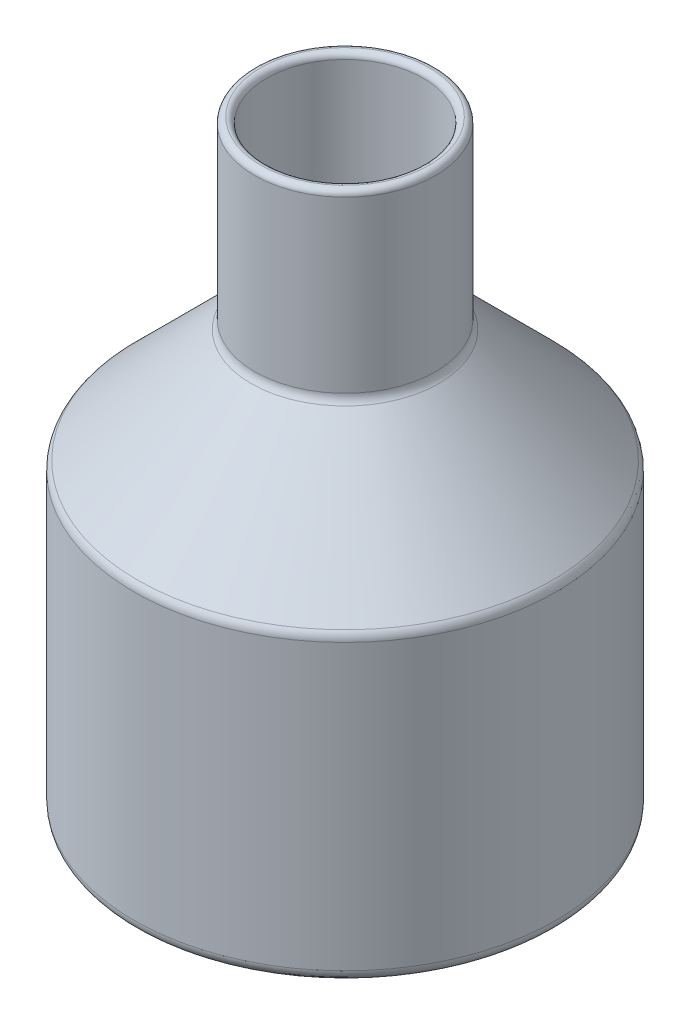
ISO-10303-21;
HEADER;
FILE_DESCRIPTION(('STEP AP214'),'2;1');
FILE_NAME('part.step','',(''),(''),'','','');
FILE_SCHEMA(('AUTOMOTIVE_DESIGN { 1 0 10303 214 1 1 1 1 }'));
ENDSEC;
DATA;
#1=APPLICATION_CONTEXT('core data for automotive mechanical design processes');
#2=APPLICATION_PROTOCOL_DEFINITION('international standard','automotive_design',2000,#1);
#3=PRODUCT_CONTEXT('',#1,'mechanical');
#4=PRODUCT('Part','Part','',(#3));
#5=PRODUCT_RELATED_PRODUCT_CATEGORY('part','',(#4));
#6=PRODUCT_DEFINITION_FORMATION('','',#4);
#7=PRODUCT_DEFINITION_CONTEXT('part definition',#1,'design');
#8=PRODUCT_DEFINITION('design','',#6,#7);
#9=PRODUCT_DEFINITION_SHAPE('','',#8);
#10=(LENGTH_UNIT() NAMED_UNIT(*) SI_UNIT(.MILLI.,.METRE.));
#11=(NAMED_UNIT(*) PLANE_ANGLE_UNIT() SI_UNIT($,.RADIAN.));
#12=(NAMED_UNIT(*) SI_UNIT($,.STERADIAN.) SOLID_ANGLE_UNIT());
#13=UNCERTAINTY_MEASURE_WITH_UNIT(LENGTH_MEASURE(1.E-05),#10,'distance_accuracy_value','');
#14=(GEOMETRIC_REPRESENTATION_CONTEXT(3) GLOBAL_UNCERTAINTY_ASSIGNED_CONTEXT((#13)) GLOBAL_UNIT_ASSIGNED_CONTEXT((#10,
#11,#12)) REPRESENTATION_CONTEXT('',''));
#15=CARTESIAN_POINT('',(0.,0.,0.));
#16=DIRECTION('',(0.,0.,1.));
#17=DIRECTION('',(1.,0.,0.));
#18=AXIS2_PLACEMENT_3D('',#15,#16,#17);
#19=CARTESIAN_POINT('',(-11.8631279596414,-69.973918824447,0.));
#20=DIRECTION('',(0.,-1.,0.));
#21=DIRECTION('',(0.,0.,-1.));
#22=AXIS2_PLACEMENT_3D('',#19,#20,#21);
#23=PLANE('',#22);
#24=CARTESIAN_POINT('',(-11.8631279596414,-69.973918824447,0.));
#25=DIRECTION('',(0.,-1.,0.));
#26=DIRECTION('',(0.,0.,-1.));
#27=AXIS2_PLACEMENT_3D('',#24,#25,#26);
#28=CIRCLE('',#27,33.);
#29=CARTESIAN_POINT('',(-11.8631279596414,-69.973918824447,-33.));
#30=VERTEX_POINT('',#29);
#31=EDGE_CURVE('E10',#30,#30,#28,.T.);
#32=ORIENTED_EDGE('',*,*,#31,.T.);
#33=EDGE_LOOP('',(#32));
#34=FACE_BOUND('',#33,.T.);
#35=ADVANCED_FACE('F31',(#34),#23,.T.);
#36=CARTESIAN_POINT('',(-11.8631279596414,50.325613141291,0.));
#37=DIRECTION('',(0.,1.,0.));
#38=DIRECTION('',(0.,0.,1.));
#39=AXIS2_PLACEMENT_3D('',#36,#37,#38);
#40=CYLINDRICAL_SURFACE('',#39,35.);
#41=CARTESIAN_POINT('',(-11.8631279596414,-67.973918824447,0.));
#42=DIRECTION('',(0.,-1.,0.));
#43=DIRECTION('',(0.,0.,-1.));
#44=AXIS2_PLACEMENT_3D('',#41,#42,#43);
#45=CIRCLE('',#44,35.);
#46=CARTESIAN_POINT('',(-11.8631279596414,-67.973918824447,-35.));
#47=VERTEX_POINT('',#46);
#48=EDGE_CURVE('E38',#47,#47,#45,.F.);
#49=ORIENTED_EDGE('',*,*,#48,.T.);
#50=EDGE_LOOP('',(#49));
#51=FACE_BOUND('',#50,.T.);
#52=CARTESIAN_POINT('',(-11.8631279596414,-20.8023459491932,0.));
#53=DIRECTION('',(0.,-1.,0.));
#54=DIRECTION('',(0.,0.,-1.));
#55=AXIS2_PLACEMENT_3D('',#52,#53,#54);
#56=CIRCLE('',#55,35.);
#57=CARTESIAN_POINT('',(-11.8631279596414,-20.8023459491932,-35.));
#58=VERTEX_POINT('',#57);
#59=EDGE_CURVE('E58',#58,#58,#56,.T.);
#60=ORIENTED_EDGE('',*,*,#59,.T.);
#61=EDGE_LOOP('',(#60));
#62=FACE_BOUND('',#61,.T.);
#63=ADVANCED_FACE('F116',(#51,#62),#40,.T.);
#64=CARTESIAN_POINT('',(-11.8631279596414,0.0260811755529999,0.));
#65=DIRECTION('',(0.,-1.,0.));
#66=DIRECTION('',(0.,0.,-1.));
#67=AXIS2_PLACEMENT_3D('',#64,#65,#66);
#68=CONICAL_SURFACE('',#67,15.,0.785398163397448);
#69=CARTESIAN_POINT('',(-11.8631279596414,-19.3881323868201,0.));
#70=DIRECTION('',(0.,1.,0.));
#71=DIRECTION('',(0.,0.,1.));
#72=AXIS2_PLACEMENT_3D('',#69,#70,#71);
#73=CIRCLE('',#72,34.4142135623731);
#74=CARTESIAN_POINT('',(-11.8631279596414,-19.3881323868201,34.4142135623731));
#75=VERTEX_POINT('',#74);
#76=EDGE_CURVE('E61',#75,#75,#73,.T.);
#77=ORIENTED_EDGE('',*,*,#76,.T.);
#78=EDGE_LOOP('',(#77));
#79=FACE_BOUND('',#78,.T.);
#80=CARTESIAN_POINT('',(-11.8631279596414,-0.559705262073905,0.));
#81=DIRECTION('',(0.,-1.,0.));
#82=DIRECTION('',(0.,0.,-1.));
#83=AXIS2_PLACEMENT_3D('',#80,#81,#82);
#84=CIRCLE('',#83,15.5857864376269);
#85=CARTESIAN_POINT('',(-11.8631279596414,-0.559705262073905,-15.5857864376269));
#86=VERTEX_POINT('',#85);
#87=EDGE_CURVE('E64',#86,#86,#84,.T.);
#88=ORIENTED_EDGE('',*,*,#87,.T.);
#89=EDGE_LOOP('',(#88));
#90=FACE_BOUND('',#89,.T.);
#91=ADVANCED_FACE('F121',(#79,#90),#68,.T.);
#92=CARTESIAN_POINT('',(-11.8631279596414,50.325613141291,0.));
#93=DIRECTION('',(0.,1.,0.));
#94=DIRECTION('',(0.,0.,1.));
#95=AXIS2_PLACEMENT_3D('',#92,#93,#94);
#96=CYLINDRICAL_SURFACE('',#95,15.);
#97=CARTESIAN_POINT('',(-11.8631279596414,29.026081175553,0.));
#98=DIRECTION('',(0.,1.,0.));
#99=DIRECTION('',(0.,0.,1.));
#100=AXIS2_PLACEMENT_3D('',#97,#98,#99);
#101=CIRCLE('',#100,15.);
#102=CARTESIAN_POINT('',(-11.8631279596414,29.026081175553,15.));
#103=VERTEX_POINT('',#102);
#104=EDGE_CURVE('E46',#103,#103,#101,.F.);
#105=ORIENTED_EDGE('',*,*,#104,.T.);
#106=EDGE_LOOP('',(#105));
#107=FACE_BOUND('',#106,.T.);
#108=CARTESIAN_POINT('',(-11.8631279596414,0.854508300299185,0.));
#109=DIRECTION('',(0.,1.,0.));
#110=DIRECTION('',(0.,0.,1.));
#111=AXIS2_PLACEMENT_3D('',#108,#109,#110);
#112=CIRCLE('',#111,15.);
#113=CARTESIAN_POINT('',(-11.8631279596414,0.854508300299185,15.));
#114=VERTEX_POINT('',#113);
#115=EDGE_CURVE('E55',#114,#114,#112,.T.);
#116=ORIENTED_EDGE('',*,*,#115,.T.);
#117=EDGE_LOOP('',(#116));
#118=FACE_BOUND('',#117,.T.);
#119=ADVANCED_FACE('F148',(#107,#118),#96,.T.);
#120=CARTESIAN_POINT('',(-11.8631279596414,50.325613141291,0.));
#121=DIRECTION('',(0.,1.,0.));
#122=DIRECTION('',(0.,0.,1.));
#123=AXIS2_PLACEMENT_3D('',#120,#121,#122);
#124=CYLINDRICAL_SURFACE('',#123,13.);
#125=CARTESIAN_POINT('',(-11.8631279596414,29.026081175553,0.));
#126=DIRECTION('',(0.,1.,0.));
#127=DIRECTION('',(0.,0.,1.));
#128=AXIS2_PLACEMENT_3D('',#125,#126,#127);
#129=CIRCLE('',#128,13.);
#130=CARTESIAN_POINT('',(-11.8631279596414,29.026081175553,13.));
#131=VERTEX_POINT('',#130);
#132=EDGE_CURVE('E42',#131,#131,#129,.T.);
#133=ORIENTED_EDGE('',*,*,#132,.T.);
#134=EDGE_LOOP('',(#133));
#135=FACE_BOUND('',#134,.T.);
#136=CARTESIAN_POINT('',(-11.8631279596414,0.026081175552993,0.));
#137=DIRECTION('',(0.,-1.,0.));
#138=DIRECTION('',(0.,0.,-1.));
#139=AXIS2_PLACEMENT_3D('',#136,#137,#138);
#140=CIRCLE('',#139,13.);
#141=CARTESIAN_POINT('',(-11.8631279596414,0.026081175552993,-13.));
#142=VERTEX_POINT('',#141);
#143=EDGE_CURVE('E76',#142,#142,#140,.T.);
#144=ORIENTED_EDGE('',*,*,#143,.T.);
#145=EDGE_LOOP('',(#144));
#146=FACE_BOUND('',#145,.T.);
#147=ADVANCED_FACE('F145',(#135,#146),#124,.F.);
#148=CARTESIAN_POINT('',(-11.8631279596414,-20.8023459491932,0.));
#149=DIRECTION('',(0.,-1.,0.));
#150=DIRECTION('',(0.,0.,-1.));
#151=AXIS2_PLACEMENT_3D('',#148,#149,#150);
#152=CONICAL_SURFACE('',#151,33.,0.785398163397448);
#153=CARTESIAN_POINT('',(-11.8631279596414,-1.3881323868201,0.));
#154=DIRECTION('',(0.,1.,0.));
#155=DIRECTION('',(0.,0.,1.));
#156=AXIS2_PLACEMENT_3D('',#153,#154,#155);
#157=CIRCLE('',#156,13.5857864376269);
#158=CARTESIAN_POINT('',(-11.8631279596414,-1.3881323868201,13.5857864376269));
#159=VERTEX_POINT('',#158);
#160=EDGE_CURVE('E79',#159,#159,#157,.T.);
#161=ORIENTED_EDGE('',*,*,#160,.T.);
#162=EDGE_LOOP('',(#161));
#163=FACE_BOUND('',#162,.T.);
#164=CARTESIAN_POINT('',(-11.8631279596414,-20.2165595115663,0.));
#165=DIRECTION('',(0.,-1.,0.));
#166=DIRECTION('',(0.,0.,-1.));
#167=AXIS2_PLACEMENT_3D('',#164,#165,#166);
#168=CIRCLE('',#167,32.4142135623731);
#169=CARTESIAN_POINT('',(-11.8631279596414,-20.2165595115663,-32.4142135623731));
#170=VERTEX_POINT('',#169);
#171=EDGE_CURVE('E51',#170,#170,#168,.T.);
#172=ORIENTED_EDGE('',*,*,#171,.T.);
#173=EDGE_LOOP('',(#172));
#174=FACE_BOUND('',#173,.T.);
#175=ADVANCED_FACE('F85',(#163,#174),#152,.F.);
#176=CARTESIAN_POINT('',(-11.8631279596414,50.325613141291,0.));
#177=DIRECTION('',(0.,1.,0.));
#178=DIRECTION('',(0.,0.,1.));
#179=AXIS2_PLACEMENT_3D('',#176,#177,#178);
#180=CYLINDRICAL_SURFACE('',#179,33.);
#181=CARTESIAN_POINT('',(-11.8631279596414,-21.6307730739394,0.));
#182=DIRECTION('',(0.,1.,0.));
#183=DIRECTION('',(0.,0.,1.));
#184=AXIS2_PLACEMENT_3D('',#181,#182,#183);
#185=CIRCLE('',#184,33.);
#186=CARTESIAN_POINT('',(-11.8631279596414,-21.6307730739394,33.));
#187=VERTEX_POINT('',#186);
#188=EDGE_CURVE('E70',#187,#187,#185,.T.);
#189=ORIENTED_EDGE('',*,*,#188,.T.);
#190=EDGE_LOOP('',(#189));
#191=FACE_BOUND('',#190,.T.);
#192=CARTESIAN_POINT('',(-11.8631279596414,-65.973918824447,0.));
#193=DIRECTION('',(0.,1.,0.));
#194=DIRECTION('',(0.,0.,1.));
#195=AXIS2_PLACEMENT_3D('',#192,#193,#194);
#196=CIRCLE('',#195,33.);
#197=CARTESIAN_POINT('',(-11.8631279596414,-65.973918824447,33.));
#198=VERTEX_POINT('',#197);
#199=EDGE_CURVE('E73',#198,#198,#196,.F.);
#200=ORIENTED_EDGE('',*,*,#199,.T.);
#201=EDGE_LOOP('',(#200));
#202=FACE_BOUND('',#201,.T.);
#203=ADVANCED_FACE('F95',(#191,#202),#180,.F.);
#204=CARTESIAN_POINT('',(-11.8631279596414,-67.973918824447,0.));
#205=DIRECTION('',(0.,1.,0.));
#206=DIRECTION('',(0.,0.,1.));
#207=AXIS2_PLACEMENT_3D('',#204,#205,#206);
#208=PLANE('',#207);
#209=CARTESIAN_POINT('',(-11.8631279596414,-67.973918824447,0.));
#210=DIRECTION('',(0.,1.,0.));
#211=DIRECTION('',(0.,0.,1.));
#212=AXIS2_PLACEMENT_3D('',#209,#210,#211);
#213=CIRCLE('',#212,31.);
#214=CARTESIAN_POINT('',(-11.8631279596414,-67.973918824447,31.));
#215=VERTEX_POINT('',#214);
#216=EDGE_CURVE('E67',#215,#215,#213,.T.);
#217=ORIENTED_EDGE('',*,*,#216,.T.);
#218=EDGE_LOOP('',(#217));
#219=FACE_BOUND('',#218,.T.);
#220=ADVANCED_FACE('F98',(#219),#208,.T.);
#221=CARTESIAN_POINT('',(-11.8631279596414,0.0260811755529913,0.));
#222=DIRECTION('',(0.,-1.,0.));
#223=DIRECTION('',(0.,0.,-1.));
#224=AXIS2_PLACEMENT_3D('',#221,#222,#223);
#225=TOROIDAL_SURFACE('',#224,15.,2.);
#226=ORIENTED_EDGE('',*,*,#143,.F.);
#227=EDGE_LOOP('',(#226));
#228=FACE_BOUND('',#227,.T.);
#229=ORIENTED_EDGE('',*,*,#160,.F.);
#230=EDGE_LOOP('',(#229));
#231=FACE_BOUND('',#230,.T.);
#232=ADVANCED_FACE('F91',(#228,#231),#225,.T.);
#233=CARTESIAN_POINT('',(-11.8631279596414,-21.6307730739394,0.));
#234=DIRECTION('',(0.,1.,0.));
#235=DIRECTION('',(0.,0.,1.));
#236=AXIS2_PLACEMENT_3D('',#233,#234,#235);
#237=TOROIDAL_SURFACE('',#236,31.,2.);
#238=ORIENTED_EDGE('',*,*,#171,.F.);
#239=EDGE_LOOP('',(#238));
#240=FACE_BOUND('',#239,.T.);
#241=ORIENTED_EDGE('',*,*,#188,.F.);
#242=EDGE_LOOP('',(#241));
#243=FACE_BOUND('',#242,.T.);
#244=ADVANCED_FACE('F87',(#240,#243),#237,.F.);
#245=CARTESIAN_POINT('',(-11.8631279596414,-65.973918824447,0.));
#246=DIRECTION('',(0.,1.,0.));
#247=DIRECTION('',(0.,0.,1.));
#248=AXIS2_PLACEMENT_3D('',#245,#246,#247);
#249=TOROIDAL_SURFACE('',#248,31.,2.);
#250=ORIENTED_EDGE('',*,*,#199,.F.);
#251=EDGE_LOOP('',(#250));
#252=FACE_BOUND('',#251,.T.);
#253=ORIENTED_EDGE('',*,*,#216,.F.);
#254=EDGE_LOOP('',(#253));
#255=FACE_BOUND('',#254,.T.);
#256=ADVANCED_FACE('F90',(#252,#255),#249,.F.);
#257=CARTESIAN_POINT('',(-11.8631279596414,-20.8023459491932,0.));
#258=DIRECTION('',(0.,-1.,0.));
#259=DIRECTION('',(0.,0.,-1.));
#260=AXIS2_PLACEMENT_3D('',#257,#258,#259);
#261=TOROIDAL_SURFACE('',#260,33.,2.);
#262=ORIENTED_EDGE('',*,*,#59,.F.);
#263=EDGE_LOOP('',(#262));
#264=FACE_BOUND('',#263,.T.);
#265=ORIENTED_EDGE('',*,*,#76,.F.);
#266=EDGE_LOOP('',(#265));
#267=FACE_BOUND('',#266,.T.);
#268=ADVANCED_FACE('F104',(#264,#267),#261,.T.);
#269=CARTESIAN_POINT('',(-11.8631279596414,0.854508300299185,0.));
#270=DIRECTION('',(0.,1.,0.));
#271=DIRECTION('',(0.,0.,1.));
#272=AXIS2_PLACEMENT_3D('',#269,#270,#271);
#273=TOROIDAL_SURFACE('',#272,17.,2.);
#274=ORIENTED_EDGE('',*,*,#87,.F.);
#275=EDGE_LOOP('',(#274));
#276=FACE_BOUND('',#275,.T.);
#277=ORIENTED_EDGE('',*,*,#115,.F.);
#278=EDGE_LOOP('',(#277));
#279=FACE_BOUND('',#278,.T.);
#280=ADVANCED_FACE('F127',(#276,#279),#273,.F.);
#281=CARTESIAN_POINT('',(-11.8631279596414,29.026081175553,0.));
#282=DIRECTION('',(0.,1.,0.));
#283=DIRECTION('',(0.,0.,1.));
#284=AXIS2_PLACEMENT_3D('',#281,#282,#283);
#285=TOROIDAL_SURFACE('',#284,14.,1.);
#286=ORIENTED_EDGE('',*,*,#132,.F.);
#287=EDGE_LOOP('',(#286));
#288=FACE_BOUND('',#287,.T.);
#289=CARTESIAN_POINT('',(-11.8631279596414,30.026081175553,0.));
#290=DIRECTION('',(0.,1.,0.));
#291=DIRECTION('',(0.,0.,1.));
#292=AXIS2_PLACEMENT_3D('',#289,#290,#291);
#293=CIRCLE('',#292,14.);
#294=CARTESIAN_POINT('',(-11.8631279596414,30.026081175553,14.));
#295=VERTEX_POINT('',#294);
#296=EDGE_CURVE('E49',#295,#295,#293,.F.);
#297=ORIENTED_EDGE('',*,*,#296,.F.);
#298=EDGE_LOOP('',(#297));
#299=FACE_BOUND('',#298,.T.);
#300=ADVANCED_FACE('F131',(#288,#299),#285,.T.);
#301=CARTESIAN_POINT('',(-11.8631279596414,29.026081175553,0.));
#302=DIRECTION('',(0.,1.,0.));
#303=DIRECTION('',(0.,0.,1.));
#304=AXIS2_PLACEMENT_3D('',#301,#302,#303);
#305=TOROIDAL_SURFACE('',#304,14.,1.);
#306=ORIENTED_EDGE('',*,*,#104,.F.);
#307=EDGE_LOOP('',(#306));
#308=FACE_BOUND('',#307,.T.);
#309=ORIENTED_EDGE('',*,*,#296,.T.);
#310=EDGE_LOOP('',(#309));
#311=FACE_BOUND('',#310,.T.);
#312=ADVANCED_FACE('F133',(#308,#311),#305,.T.);
#313=CARTESIAN_POINT('',(-11.8631279596414,-67.973918824447,0.));
#314=DIRECTION('',(0.,-1.,0.));
#315=DIRECTION('',(0.,0.,-1.));
#316=AXIS2_PLACEMENT_3D('',#313,#314,#315);
#317=TOROIDAL_SURFACE('',#316,33.,2.);
#318=ORIENTED_EDGE('',*,*,#31,.F.);
#319=EDGE_LOOP('',(#318));
#320=FACE_BOUND('',#319,.T.);
#321=ORIENTED_EDGE('',*,*,#48,.F.);
#322=EDGE_LOOP('',(#321));
#323=FACE_BOUND('',#322,.T.);
#324=ADVANCED_FACE('F33',(#320,#323),#317,.T.);
#325=CLOSED_SHELL('',(#35,#63,#91,#119,#147,#175,#203,#220,#232,#244,#256,#268,#280,#300,#312,#324));
#326=MANIFOLD_SOLID_BREP('B2',#325);
#327=ADVANCED_BREP_SHAPE_REPRESENTATION('',(#18,#326),#14);
#328=SHAPE_DEFINITION_REPRESENTATION(#9,#327);
ENDSEC;
END-ISO-10303-21;
